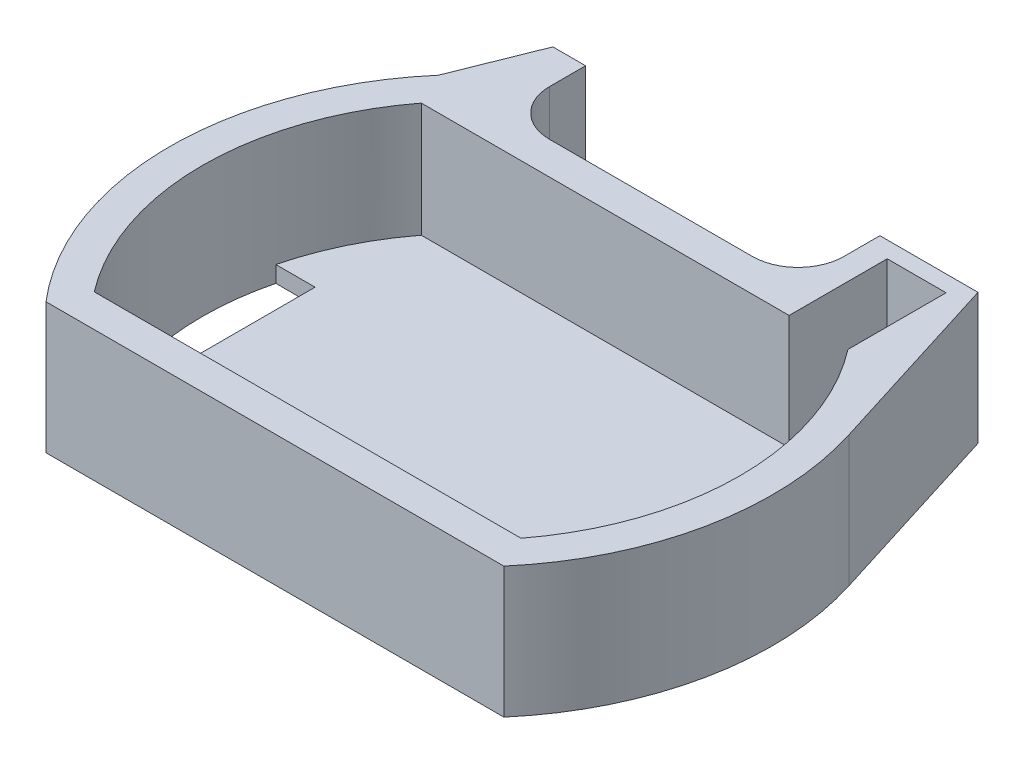
ISO-10303-21;
HEADER;
FILE_DESCRIPTION(('STEP AP214'),'2;1');
FILE_NAME('part.step','',(''),(''),'','','');
FILE_SCHEMA(('AUTOMOTIVE_DESIGN { 1 0 10303 214 1 1 1 1 }'));
ENDSEC;
DATA;
#1=APPLICATION_CONTEXT('core data for automotive mechanical design processes');
#2=APPLICATION_PROTOCOL_DEFINITION('international standard','automotive_design',2000,#1);
#3=PRODUCT_CONTEXT('',#1,'mechanical');
#4=PRODUCT('Part','Part','',(#3));
#5=PRODUCT_RELATED_PRODUCT_CATEGORY('part','',(#4));
#6=PRODUCT_DEFINITION_FORMATION('','',#4);
#7=PRODUCT_DEFINITION_CONTEXT('part definition',#1,'design');
#8=PRODUCT_DEFINITION('design','',#6,#7);
#9=PRODUCT_DEFINITION_SHAPE('','',#8);
#10=(LENGTH_UNIT() NAMED_UNIT(*) SI_UNIT(.MILLI.,.METRE.));
#11=(NAMED_UNIT(*) PLANE_ANGLE_UNIT() SI_UNIT($,.RADIAN.));
#12=(NAMED_UNIT(*) SI_UNIT($,.STERADIAN.) SOLID_ANGLE_UNIT());
#13=UNCERTAINTY_MEASURE_WITH_UNIT(LENGTH_MEASURE(1.E-05),#10,'distance_accuracy_value','');
#14=(GEOMETRIC_REPRESENTATION_CONTEXT(3) GLOBAL_UNCERTAINTY_ASSIGNED_CONTEXT((#13)) GLOBAL_UNIT_ASSIGNED_CONTEXT((#10,
#11,#12)) REPRESENTATION_CONTEXT('',''));
#15=CARTESIAN_POINT('',(0.,0.,0.));
#16=DIRECTION('',(0.,0.,1.));
#17=DIRECTION('',(1.,0.,0.));
#18=AXIS2_PLACEMENT_3D('',#15,#16,#17);
#19=CARTESIAN_POINT('',(0.,6.35,0.));
#20=DIRECTION('',(0.,1.,0.));
#21=DIRECTION('',(0.,0.,1.));
#22=AXIS2_PLACEMENT_3D('',#19,#20,#21);
#23=PLANE('',#22);
#24=DIRECTION('',(1.,0.,0.));
#25=VECTOR('',#24,1.);
#26=CARTESIAN_POINT('',(-86.010873324463,6.35,25.4));
#27=LINE('',#26,#25);
#28=CARTESIAN_POINT('',(-101.250873324463,6.35,25.4));
#29=VERTEX_POINT('',#28);
#30=CARTESIAN_POINT('',(-86.010873324463,6.35,25.4));
#31=VERTEX_POINT('',#30);
#32=EDGE_CURVE('E361',#29,#31,#27,.T.);
#33=ORIENTED_EDGE('',*,*,#32,.F.);
#34=CARTESIAN_POINT('',(0.,6.35,0.));
#35=DIRECTION('',(0.,1.,0.));
#36=DIRECTION('',(0.,0.,1.));
#37=AXIS2_PLACEMENT_3D('',#34,#35,#36);
#38=CIRCLE('',#37,104.38821460762);
#39=CARTESIAN_POINT('',(-82.8531794740942,6.35,63.5));
#40=VERTEX_POINT('',#39);
#41=EDGE_CURVE('E266',#29,#40,#38,.T.);
#42=ORIENTED_EDGE('',*,*,#41,.T.);
#43=DIRECTION('',(1.,0.,0.));
#44=VECTOR('',#43,1.);
#45=CARTESIAN_POINT('',(-82.8531794740942,6.35,63.5));
#46=LINE('',#45,#44);
#47=CARTESIAN_POINT('',(82.8531794740942,6.35,63.5));
#48=VERTEX_POINT('',#47);
#49=EDGE_CURVE('E264',#40,#48,#46,.T.);
#50=ORIENTED_EDGE('',*,*,#49,.T.);
#51=CARTESIAN_POINT('',(0.,6.35,0.));
#52=DIRECTION('',(0.,1.,0.));
#53=DIRECTION('',(0.,0.,1.));
#54=AXIS2_PLACEMENT_3D('',#51,#52,#53);
#55=CIRCLE('',#54,104.38821460762);
#56=CARTESIAN_POINT('',(101.250873324463,6.35,25.3999999999999));
#57=VERTEX_POINT('',#56);
#58=EDGE_CURVE('E270',#48,#57,#55,.T.);
#59=ORIENTED_EDGE('',*,*,#58,.T.);
#60=DIRECTION('',(1.,0.,0.));
#61=VECTOR('',#60,1.);
#62=CARTESIAN_POINT('',(86.010873324463,6.35,25.4));
#63=LINE('',#62,#61);
#64=CARTESIAN_POINT('',(86.010873324463,6.35,25.4));
#65=VERTEX_POINT('',#64);
#66=EDGE_CURVE('E328',#65,#57,#63,.T.);
#67=ORIENTED_EDGE('',*,*,#66,.F.);
#68=DIRECTION('',(0.,0.,1.));
#69=VECTOR('',#68,1.);
#70=CARTESIAN_POINT('',(86.010873324463,6.35,-25.4));
#71=LINE('',#70,#69);
#72=CARTESIAN_POINT('',(86.010873324463,6.35,-25.4));
#73=VERTEX_POINT('',#72);
#74=EDGE_CURVE('E323',#73,#65,#71,.T.);
#75=ORIENTED_EDGE('',*,*,#74,.F.);
#76=DIRECTION('',(-1.,0.,0.));
#77=VECTOR('',#76,1.);
#78=CARTESIAN_POINT('',(101.250873324463,6.35,-25.4));
#79=LINE('',#78,#77);
#80=CARTESIAN_POINT('',(101.250873324463,6.35,-25.4));
#81=VERTEX_POINT('',#80);
#82=EDGE_CURVE('E320',#81,#73,#79,.T.);
#83=ORIENTED_EDGE('',*,*,#82,.F.);
#84=CARTESIAN_POINT('',(82.8531794740942,6.35,-63.5));
#85=VERTEX_POINT('',#84);
#86=EDGE_CURVE('E274',#81,#85,#55,.T.);
#87=ORIENTED_EDGE('',*,*,#86,.T.);
#88=DIRECTION('',(0.,0.,1.));
#89=VECTOR('',#88,1.);
#90=CARTESIAN_POINT('',(82.8531794740942,6.35,-63.5));
#91=LINE('',#90,#89);
#92=CARTESIAN_POINT('',(82.8531794740942,6.35,-101.6));
#93=VERTEX_POINT('',#92);
#94=EDGE_CURVE('E229',#93,#85,#91,.T.);
#95=ORIENTED_EDGE('',*,*,#94,.F.);
#96=DIRECTION('',(1.,0.,0.));
#97=VECTOR('',#96,1.);
#98=CARTESIAN_POINT('',(59.9931794740942,6.35,-101.6));
#99=LINE('',#98,#97);
#100=CARTESIAN_POINT('',(59.9931794740942,6.35,-101.6));
#101=VERTEX_POINT('',#100);
#102=EDGE_CURVE('E928',#101,#93,#99,.T.);
#103=ORIENTED_EDGE('',*,*,#102,.F.);
#104=DIRECTION('',(0.,0.,-1.));
#105=VECTOR('',#104,1.);
#106=CARTESIAN_POINT('',(59.9931794740942,6.35,-63.5));
#107=LINE('',#106,#105);
#108=CARTESIAN_POINT('',(59.9931794740941,6.35,-63.5));
#109=VERTEX_POINT('',#108);
#110=EDGE_CURVE('E532',#109,#101,#107,.T.);
#111=ORIENTED_EDGE('',*,*,#110,.F.);
#112=DIRECTION('',(-1.,0.,0.));
#113=VECTOR('',#112,1.);
#114=CARTESIAN_POINT('',(-82.8531794740941,6.35,-63.5));
#115=LINE('',#114,#113);
#116=CARTESIAN_POINT('',(-82.8531794740941,6.35,-63.5));
#117=VERTEX_POINT('',#116);
#118=EDGE_CURVE('E273',#109,#117,#115,.T.);
#119=ORIENTED_EDGE('',*,*,#118,.T.);
#120=CARTESIAN_POINT('',(-101.250873324463,6.35,-25.4));
#121=VERTEX_POINT('',#120);
#122=EDGE_CURVE('E261',#117,#121,#38,.T.);
#123=ORIENTED_EDGE('',*,*,#122,.T.);
#124=DIRECTION('',(-1.,0.,0.));
#125=VECTOR('',#124,1.);
#126=CARTESIAN_POINT('',(-101.250873324463,6.35,-25.4));
#127=LINE('',#126,#125);
#128=CARTESIAN_POINT('',(-86.010873324463,6.35,-25.4));
#129=VERTEX_POINT('',#128);
#130=EDGE_CURVE('E369',#129,#121,#127,.T.);
#131=ORIENTED_EDGE('',*,*,#130,.F.);
#132=DIRECTION('',(0.,0.,-1.));
#133=VECTOR('',#132,1.);
#134=CARTESIAN_POINT('',(-86.010873324463,6.35,-25.4));
#135=LINE('',#134,#133);
#136=EDGE_CURVE('E364',#31,#129,#135,.T.);
#137=ORIENTED_EDGE('',*,*,#136,.F.);
#138=EDGE_LOOP('',(#33,#42,#50,#59,#67,#75,#83,#87,#95,#103,#111,#119,#123,#131,#137));
#139=FACE_BOUND('',#138,.T.);
#140=ADVANCED_FACE('F43',(#139),#23,.T.);
#141=CARTESIAN_POINT('',(0.,0.,0.));
#142=DIRECTION('',(0.,1.,0.));
#143=DIRECTION('',(0.,0.,1.));
#144=AXIS2_PLACEMENT_3D('',#141,#142,#143);
#145=PLANE('',#144);
#146=CARTESIAN_POINT('',(0.,0.,0.));
#147=DIRECTION('',(0.,1.,0.));
#148=DIRECTION('',(0.,0.,1.));
#149=AXIS2_PLACEMENT_3D('',#146,#147,#148);
#150=CIRCLE('',#149,104.38821460762);
#151=CARTESIAN_POINT('',(-101.250873324463,0.,-25.4));
#152=VERTEX_POINT('',#151);
#153=CARTESIAN_POINT('',(-101.250873324463,0.,25.4));
#154=VERTEX_POINT('',#153);
#155=EDGE_CURVE('E360',#152,#154,#150,.T.);
#156=ORIENTED_EDGE('',*,*,#155,.T.);
#157=DIRECTION('',(1.,0.,0.));
#158=VECTOR('',#157,1.);
#159=CARTESIAN_POINT('',(-86.010873324463,0.,25.4));
#160=LINE('',#159,#158);
#161=CARTESIAN_POINT('',(-86.010873324463,0.,25.4));
#162=VERTEX_POINT('',#161);
#163=EDGE_CURVE('E377',#154,#162,#160,.T.);
#164=ORIENTED_EDGE('',*,*,#163,.T.);
#165=DIRECTION('',(0.,0.,-1.));
#166=VECTOR('',#165,1.);
#167=CARTESIAN_POINT('',(-86.010873324463,0.,-25.4));
#168=LINE('',#167,#166);
#169=CARTESIAN_POINT('',(-86.010873324463,0.,-25.4));
#170=VERTEX_POINT('',#169);
#171=EDGE_CURVE('E381',#162,#170,#168,.T.);
#172=ORIENTED_EDGE('',*,*,#171,.T.);
#173=DIRECTION('',(-1.,0.,0.));
#174=VECTOR('',#173,1.);
#175=CARTESIAN_POINT('',(-101.250873324463,0.,-25.4));
#176=LINE('',#175,#174);
#177=EDGE_CURVE('E365',#170,#152,#176,.T.);
#178=ORIENTED_EDGE('',*,*,#177,.T.);
#179=EDGE_LOOP('',(#156,#164,#172,#178));
#180=FACE_BOUND('',#179,.T.);
#181=CARTESIAN_POINT('',(0.,0.,0.));
#182=DIRECTION('',(0.,1.,0.));
#183=DIRECTION('',(0.,0.,1.));
#184=AXIS2_PLACEMENT_3D('',#181,#182,#183);
#185=CIRCLE('',#184,117.08821460762);
#186=CARTESIAN_POINT('',(-88.9,0.,-76.2));
#187=VERTEX_POINT('',#186);
#188=CARTESIAN_POINT('',(-88.9,0.,76.2));
#189=VERTEX_POINT('',#188);
#190=EDGE_CURVE('E401',#187,#189,#185,.T.);
#191=ORIENTED_EDGE('',*,*,#190,.F.);
#192=DIRECTION('',(-0.371390676354103,0.,0.92847669088526));
#193=VECTOR('',#192,1.);
#194=CARTESIAN_POINT('',(-88.9,0.,-76.2));
#195=LINE('',#194,#193);
#196=CARTESIAN_POINT('',(-76.2,0.,-107.95));
#197=VERTEX_POINT('',#196);
#198=EDGE_CURVE('E428',#197,#187,#195,.T.);
#199=ORIENTED_EDGE('',*,*,#198,.F.);
#200=DIRECTION('',(-1.,0.,0.));
#201=VECTOR('',#200,1.);
#202=CARTESIAN_POINT('',(-76.2,0.,-107.95));
#203=LINE('',#202,#201);
#204=CARTESIAN_POINT('',(-63.5,0.,-107.95));
#205=VERTEX_POINT('',#204);
#206=EDGE_CURVE('E425',#205,#197,#203,.T.);
#207=ORIENTED_EDGE('',*,*,#206,.F.);
#208=DIRECTION('',(0.,0.,-1.));
#209=VECTOR('',#208,1.);
#210=CARTESIAN_POINT('',(-63.5,0.,-107.95));
#211=LINE('',#210,#209);
#212=CARTESIAN_POINT('',(-63.5,0.,-93.98));
#213=VERTEX_POINT('',#212);
#214=EDGE_CURVE('E422',#213,#205,#211,.T.);
#215=ORIENTED_EDGE('',*,*,#214,.F.);
#216=CARTESIAN_POINT('',(-45.72,0.,-93.98));
#217=DIRECTION('',(0.,1.,0.));
#218=DIRECTION('',(0.,0.,1.));
#219=AXIS2_PLACEMENT_3D('',#216,#217,#218);
#220=CIRCLE('',#219,17.78);
#221=CARTESIAN_POINT('',(-45.72,0.,-76.2));
#222=VERTEX_POINT('',#221);
#223=EDGE_CURVE('E52',#213,#222,#220,.T.);
#224=ORIENTED_EDGE('',*,*,#223,.T.);
#225=DIRECTION('',(-1.,0.,0.));
#226=VECTOR('',#225,1.);
#227=CARTESIAN_POINT('',(-63.5,0.,-76.2));
#228=LINE('',#227,#226);
#229=CARTESIAN_POINT('',(33.02,0.,-76.2));
#230=VERTEX_POINT('',#229);
#231=EDGE_CURVE('E418',#230,#222,#228,.T.);
#232=ORIENTED_EDGE('',*,*,#231,.F.);
#233=CARTESIAN_POINT('',(33.02,0.,-93.98));
#234=DIRECTION('',(0.,1.,0.));
#235=DIRECTION('',(0.,0.,1.));
#236=AXIS2_PLACEMENT_3D('',#233,#234,#235);
#237=CIRCLE('',#236,17.78);
#238=CARTESIAN_POINT('',(50.8,0.,-93.98));
#239=VERTEX_POINT('',#238);
#240=EDGE_CURVE('E475',#230,#239,#237,.T.);
#241=ORIENTED_EDGE('',*,*,#240,.T.);
#242=DIRECTION('',(0.,0.,-1.));
#243=VECTOR('',#242,1.);
#244=CARTESIAN_POINT('',(50.8,0.,-107.95));
#245=LINE('',#244,#243);
#246=CARTESIAN_POINT('',(50.8,0.,-107.95));
#247=VERTEX_POINT('',#246);
#248=EDGE_CURVE('E265',#239,#247,#245,.T.);
#249=ORIENTED_EDGE('',*,*,#248,.T.);
#250=DIRECTION('',(-1.,0.,0.));
#251=VECTOR('',#250,1.);
#252=CARTESIAN_POINT('',(88.9,0.,-107.95));
#253=LINE('',#252,#251);
#254=CARTESIAN_POINT('',(88.9,0.,-107.95));
#255=VERTEX_POINT('',#254);
#256=EDGE_CURVE('E414',#255,#247,#253,.T.);
#257=ORIENTED_EDGE('',*,*,#256,.F.);
#258=DIRECTION('',(-0.298726159680136,0.,-0.954338871430247));
#259=VECTOR('',#258,1.);
#260=CARTESIAN_POINT('',(111.741834586418,0.,-34.9773126935378));
#261=LINE('',#260,#259);
#262=CARTESIAN_POINT('',(111.741834586418,0.,-34.9773126935378));
#263=VERTEX_POINT('',#262);
#264=EDGE_CURVE('E411',#263,#255,#261,.T.);
#265=ORIENTED_EDGE('',*,*,#264,.F.);
#266=CARTESIAN_POINT('',(0.,0.,0.));
#267=DIRECTION('',(0.,1.,0.));
#268=DIRECTION('',(0.,0.,-1.));
#269=AXIS2_PLACEMENT_3D('',#266,#267,#268);
#270=CIRCLE('',#269,117.08821460762);
#271=CARTESIAN_POINT('',(88.9,0.,76.2));
#272=VERTEX_POINT('',#271);
#273=EDGE_CURVE('E408',#272,#263,#270,.T.);
#274=ORIENTED_EDGE('',*,*,#273,.F.);
#275=DIRECTION('',(1.,0.,0.));
#276=VECTOR('',#275,1.);
#277=CARTESIAN_POINT('',(-88.9,0.,76.2));
#278=LINE('',#277,#276);
#279=EDGE_CURVE('E405',#189,#272,#278,.T.);
#280=ORIENTED_EDGE('',*,*,#279,.F.);
#281=EDGE_LOOP('',(#191,#199,#207,#215,#224,#232,#241,#249,#257,#265,#274,#280));
#282=FACE_BOUND('',#281,.T.);
#283=CARTESIAN_POINT('',(0.,0.,0.));
#284=DIRECTION('',(0.,1.,0.));
#285=DIRECTION('',(0.,0.,-1.));
#286=AXIS2_PLACEMENT_3D('',#283,#284,#285);
#287=CIRCLE('',#286,104.38821460762);
#288=CARTESIAN_POINT('',(101.250873324463,0.,25.3999999999999));
#289=VERTEX_POINT('',#288);
#290=CARTESIAN_POINT('',(101.250873324463,0.,-25.4));
#291=VERTEX_POINT('',#290);
#292=EDGE_CURVE('E319',#289,#291,#287,.T.);
#293=ORIENTED_EDGE('',*,*,#292,.T.);
#294=DIRECTION('',(-1.,0.,0.));
#295=VECTOR('',#294,1.);
#296=CARTESIAN_POINT('',(101.250873324463,0.,-25.4));
#297=LINE('',#296,#295);
#298=CARTESIAN_POINT('',(86.010873324463,0.,-25.4));
#299=VERTEX_POINT('',#298);
#300=EDGE_CURVE('E336',#291,#299,#297,.T.);
#301=ORIENTED_EDGE('',*,*,#300,.T.);
#302=DIRECTION('',(0.,0.,1.));
#303=VECTOR('',#302,1.);
#304=CARTESIAN_POINT('',(86.010873324463,0.,-25.4));
#305=LINE('',#304,#303);
#306=CARTESIAN_POINT('',(86.010873324463,0.,25.4));
#307=VERTEX_POINT('',#306);
#308=EDGE_CURVE('E340',#299,#307,#305,.T.);
#309=ORIENTED_EDGE('',*,*,#308,.T.);
#310=DIRECTION('',(1.,0.,0.));
#311=VECTOR('',#310,1.);
#312=CARTESIAN_POINT('',(86.010873324463,0.,25.4));
#313=LINE('',#312,#311);
#314=EDGE_CURVE('E324',#307,#289,#313,.T.);
#315=ORIENTED_EDGE('',*,*,#314,.T.);
#316=EDGE_LOOP('',(#293,#301,#309,#315));
#317=FACE_BOUND('',#316,.T.);
#318=ADVANCED_FACE('F482',(#180,#282,#317),#145,.F.);
#319=CARTESIAN_POINT('',(0.,6.35,0.));
#320=DIRECTION('',(0.,-1.,0.));
#321=DIRECTION('',(0.,0.,-1.));
#322=AXIS2_PLACEMENT_3D('',#319,#320,#321);
#323=CYLINDRICAL_SURFACE('',#322,117.08821460762);
#324=ORIENTED_EDGE('',*,*,#190,.T.);
#325=DIRECTION('',(0.,-1.,0.));
#326=VECTOR('',#325,1.);
#327=CARTESIAN_POINT('',(-88.9,6.35,76.2));
#328=LINE('',#327,#326);
#329=CARTESIAN_POINT('',(-88.9,50.8,76.2));
#330=VERTEX_POINT('',#329);
#331=EDGE_CURVE('E455',#330,#189,#328,.T.);
#332=ORIENTED_EDGE('',*,*,#331,.F.);
#333=CARTESIAN_POINT('',(0.,50.8,0.));
#334=DIRECTION('',(0.,1.,0.));
#335=DIRECTION('',(0.,0.,1.));
#336=AXIS2_PLACEMENT_3D('',#333,#334,#335);
#337=CIRCLE('',#336,117.08821460762);
#338=CARTESIAN_POINT('',(-88.9,50.8,-76.2));
#339=VERTEX_POINT('',#338);
#340=EDGE_CURVE('E311',#339,#330,#337,.T.);
#341=ORIENTED_EDGE('',*,*,#340,.F.);
#342=DIRECTION('',(0.,-1.,0.));
#343=VECTOR('',#342,1.);
#344=CARTESIAN_POINT('',(-88.9,6.35,-76.2));
#345=LINE('',#344,#343);
#346=EDGE_CURVE('E431',#339,#187,#345,.T.);
#347=ORIENTED_EDGE('',*,*,#346,.T.);
#348=EDGE_LOOP('',(#324,#332,#341,#347));
#349=FACE_BOUND('',#348,.T.);
#350=ADVANCED_FACE('F501',(#349),#323,.T.);
#351=CARTESIAN_POINT('',(-88.9,6.35,76.2));
#352=DIRECTION('',(0.,0.,-1.));
#353=DIRECTION('',(-1.,0.,0.));
#354=AXIS2_PLACEMENT_3D('',#351,#352,#353);
#355=PLANE('',#354);
#356=ORIENTED_EDGE('',*,*,#279,.T.);
#357=DIRECTION('',(0.,-1.,0.));
#358=VECTOR('',#357,1.);
#359=CARTESIAN_POINT('',(88.9,6.35,76.2));
#360=LINE('',#359,#358);
#361=CARTESIAN_POINT('',(88.9,50.8,76.2));
#362=VERTEX_POINT('',#361);
#363=EDGE_CURVE('E451',#362,#272,#360,.T.);
#364=ORIENTED_EDGE('',*,*,#363,.F.);
#365=DIRECTION('',(1.,0.,0.));
#366=VECTOR('',#365,1.);
#367=CARTESIAN_POINT('',(-88.9,50.8,76.2));
#368=LINE('',#367,#366);
#369=EDGE_CURVE('E315',#330,#362,#368,.T.);
#370=ORIENTED_EDGE('',*,*,#369,.F.);
#371=ORIENTED_EDGE('',*,*,#331,.T.);
#372=EDGE_LOOP('',(#356,#364,#370,#371));
#373=FACE_BOUND('',#372,.T.);
#374=ADVANCED_FACE('F506',(#373),#355,.F.);
#375=CARTESIAN_POINT('',(0.,6.35,0.));
#376=DIRECTION('',(0.,-1.,0.));
#377=DIRECTION('',(0.,0.,-1.));
#378=AXIS2_PLACEMENT_3D('',#375,#376,#377);
#379=CYLINDRICAL_SURFACE('',#378,117.08821460762);
#380=ORIENTED_EDGE('',*,*,#273,.T.);
#381=DIRECTION('',(0.,-1.,0.));
#382=VECTOR('',#381,1.);
#383=CARTESIAN_POINT('',(111.741834586418,6.35,-34.9773126935378));
#384=LINE('',#383,#382);
#385=CARTESIAN_POINT('',(111.741834586418,50.8,-34.9773126935378));
#386=VERTEX_POINT('',#385);
#387=EDGE_CURVE('E447',#386,#263,#384,.T.);
#388=ORIENTED_EDGE('',*,*,#387,.F.);
#389=CARTESIAN_POINT('',(0.,50.8,0.));
#390=DIRECTION('',(0.,1.,0.));
#391=DIRECTION('',(0.,0.,1.));
#392=AXIS2_PLACEMENT_3D('',#389,#390,#391);
#393=CIRCLE('',#392,117.08821460762);
#394=EDGE_CURVE('E286',#362,#386,#393,.T.);
#395=ORIENTED_EDGE('',*,*,#394,.F.);
#396=ORIENTED_EDGE('',*,*,#363,.T.);
#397=EDGE_LOOP('',(#380,#388,#395,#396));
#398=FACE_BOUND('',#397,.T.);
#399=ADVANCED_FACE('F509',(#398),#379,.T.);
#400=CARTESIAN_POINT('',(111.741834586418,6.35,-34.9773126935378));
#401=DIRECTION('',(-0.954338871430247,0.,0.298726159680136));
#402=DIRECTION('',(0.298726159680136,0.,0.954338871430247));
#403=AXIS2_PLACEMENT_3D('',#400,#401,#402);
#404=PLANE('',#403);
#405=ORIENTED_EDGE('',*,*,#264,.T.);
#406=DIRECTION('',(0.,-1.,0.));
#407=VECTOR('',#406,1.);
#408=CARTESIAN_POINT('',(88.9,6.35,-107.95));
#409=LINE('',#408,#407);
#410=CARTESIAN_POINT('',(88.9,50.8,-107.95));
#411=VERTEX_POINT('',#410);
#412=EDGE_CURVE('E443',#411,#255,#409,.T.);
#413=ORIENTED_EDGE('',*,*,#412,.F.);
#414=DIRECTION('',(-0.298726159680136,0.,-0.954338871430247));
#415=VECTOR('',#414,1.);
#416=CARTESIAN_POINT('',(111.741834586418,50.8,-34.9773126935378));
#417=LINE('',#416,#415);
#418=EDGE_CURVE('E290',#386,#411,#417,.T.);
#419=ORIENTED_EDGE('',*,*,#418,.F.);
#420=ORIENTED_EDGE('',*,*,#387,.T.);
#421=EDGE_LOOP('',(#405,#413,#419,#420));
#422=FACE_BOUND('',#421,.T.);
#423=ADVANCED_FACE('F512',(#422),#404,.F.);
#424=CARTESIAN_POINT('',(88.9,6.35,-107.95));
#425=DIRECTION('',(0.,0.,1.));
#426=DIRECTION('',(1.,0.,0.));
#427=AXIS2_PLACEMENT_3D('',#424,#425,#426);
#428=PLANE('',#427);
#429=ORIENTED_EDGE('',*,*,#256,.T.);
#430=DIRECTION('',(0.,1.,0.));
#431=VECTOR('',#430,1.);
#432=CARTESIAN_POINT('',(50.8,-34.1957965253041,-107.95));
#433=LINE('',#432,#431);
#434=CARTESIAN_POINT('',(50.8,50.8,-107.95));
#435=VERTEX_POINT('',#434);
#436=EDGE_CURVE('E520',#247,#435,#433,.T.);
#437=ORIENTED_EDGE('',*,*,#436,.T.);
#438=DIRECTION('',(-1.,0.,0.));
#439=VECTOR('',#438,1.);
#440=CARTESIAN_POINT('',(88.9,50.8,-107.95));
#441=LINE('',#440,#439);
#442=EDGE_CURVE('E294',#411,#435,#441,.T.);
#443=ORIENTED_EDGE('',*,*,#442,.F.);
#444=ORIENTED_EDGE('',*,*,#412,.T.);
#445=EDGE_LOOP('',(#429,#437,#443,#444));
#446=FACE_BOUND('',#445,.T.);
#447=ADVANCED_FACE('F517',(#446),#428,.F.);
#448=CARTESIAN_POINT('',(-63.5,6.35,-76.2));
#449=DIRECTION('',(0.,0.,1.));
#450=DIRECTION('',(1.,0.,0.));
#451=AXIS2_PLACEMENT_3D('',#448,#449,#450);
#452=PLANE('',#451);
#453=DIRECTION('',(-1.,0.,0.));
#454=VECTOR('',#453,1.);
#455=CARTESIAN_POINT('',(63.5,50.8,-76.2));
#456=LINE('',#455,#454);
#457=CARTESIAN_POINT('',(33.02,50.8,-76.2));
#458=VERTEX_POINT('',#457);
#459=CARTESIAN_POINT('',(-45.72,50.8,-76.2));
#460=VERTEX_POINT('',#459);
#461=EDGE_CURVE('E297',#458,#460,#456,.T.);
#462=ORIENTED_EDGE('',*,*,#461,.F.);
#463=DIRECTION('',(0.,1.,0.));
#464=VECTOR('',#463,1.);
#465=CARTESIAN_POINT('',(33.02,6.35,-76.2));
#466=LINE('',#465,#464);
#467=EDGE_CURVE('E466',#458,#230,#466,.F.);
#468=ORIENTED_EDGE('',*,*,#467,.T.);
#469=ORIENTED_EDGE('',*,*,#231,.T.);
#470=DIRECTION('',(0.,-1.,0.));
#471=VECTOR('',#470,1.);
#472=CARTESIAN_POINT('',(-45.72,50.8,-76.2));
#473=LINE('',#472,#471);
#474=EDGE_CURVE('E463',#222,#460,#473,.F.);
#475=ORIENTED_EDGE('',*,*,#474,.T.);
#476=EDGE_LOOP('',(#462,#468,#469,#475));
#477=FACE_BOUND('',#476,.T.);
#478=ADVANCED_FACE('F488',(#477),#452,.F.);
#479=CARTESIAN_POINT('',(-63.5,6.35,-107.95));
#480=DIRECTION('',(-1.,0.,0.));
#481=DIRECTION('',(0.,0.,1.));
#482=AXIS2_PLACEMENT_3D('',#479,#480,#481);
#483=PLANE('',#482);
#484=DIRECTION('',(0.,0.,-1.));
#485=VECTOR('',#484,1.);
#486=CARTESIAN_POINT('',(-63.5,50.8,-76.2));
#487=LINE('',#486,#485);
#488=CARTESIAN_POINT('',(-63.5,50.8,-93.98));
#489=VERTEX_POINT('',#488);
#490=CARTESIAN_POINT('',(-63.5,50.8,-107.95));
#491=VERTEX_POINT('',#490);
#492=EDGE_CURVE('E300',#489,#491,#487,.T.);
#493=ORIENTED_EDGE('',*,*,#492,.F.);
#494=DIRECTION('',(0.,-1.,0.));
#495=VECTOR('',#494,1.);
#496=CARTESIAN_POINT('',(-63.5,0.,-93.98));
#497=LINE('',#496,#495);
#498=EDGE_CURVE('E469',#489,#213,#497,.T.);
#499=ORIENTED_EDGE('',*,*,#498,.T.);
#500=ORIENTED_EDGE('',*,*,#214,.T.);
#501=DIRECTION('',(0.,-1.,0.));
#502=VECTOR('',#501,1.);
#503=CARTESIAN_POINT('',(-63.5,6.35,-107.95));
#504=LINE('',#503,#502);
#505=EDGE_CURVE('E439',#491,#205,#504,.T.);
#506=ORIENTED_EDGE('',*,*,#505,.F.);
#507=EDGE_LOOP('',(#493,#499,#500,#506));
#508=FACE_BOUND('',#507,.T.);
#509=ADVANCED_FACE('F491',(#508),#483,.F.);
#510=CARTESIAN_POINT('',(-76.2,6.35,-107.95));
#511=DIRECTION('',(0.,0.,1.));
#512=DIRECTION('',(1.,0.,0.));
#513=AXIS2_PLACEMENT_3D('',#510,#511,#512);
#514=PLANE('',#513);
#515=ORIENTED_EDGE('',*,*,#206,.T.);
#516=DIRECTION('',(0.,-1.,0.));
#517=VECTOR('',#516,1.);
#518=CARTESIAN_POINT('',(-76.2,6.35,-107.95));
#519=LINE('',#518,#517);
#520=CARTESIAN_POINT('',(-76.2,50.8,-107.95));
#521=VERTEX_POINT('',#520);
#522=EDGE_CURVE('E435',#521,#197,#519,.T.);
#523=ORIENTED_EDGE('',*,*,#522,.F.);
#524=DIRECTION('',(-1.,0.,0.));
#525=VECTOR('',#524,1.);
#526=CARTESIAN_POINT('',(-63.5,50.8,-107.95));
#527=LINE('',#526,#525);
#528=EDGE_CURVE('E303',#491,#521,#527,.T.);
#529=ORIENTED_EDGE('',*,*,#528,.F.);
#530=ORIENTED_EDGE('',*,*,#505,.T.);
#531=EDGE_LOOP('',(#515,#523,#529,#530));
#532=FACE_BOUND('',#531,.T.);
#533=ADVANCED_FACE('F587',(#532),#514,.F.);
#534=CARTESIAN_POINT('',(-88.9,6.35,-76.2));
#535=DIRECTION('',(0.92847669088526,0.,0.371390676354103));
#536=DIRECTION('',(0.371390676354103,0.,-0.92847669088526));
#537=AXIS2_PLACEMENT_3D('',#534,#535,#536);
#538=PLANE('',#537);
#539=ORIENTED_EDGE('',*,*,#198,.T.);
#540=ORIENTED_EDGE('',*,*,#346,.F.);
#541=DIRECTION('',(-0.371390676354103,0.,0.92847669088526));
#542=VECTOR('',#541,1.);
#543=CARTESIAN_POINT('',(-76.2,50.8,-107.95));
#544=LINE('',#543,#542);
#545=EDGE_CURVE('E307',#521,#339,#544,.T.);
#546=ORIENTED_EDGE('',*,*,#545,.F.);
#547=ORIENTED_EDGE('',*,*,#522,.T.);
#548=EDGE_LOOP('',(#539,#540,#546,#547));
#549=FACE_BOUND('',#548,.T.);
#550=ADVANCED_FACE('F498',(#549),#538,.F.);
#551=CARTESIAN_POINT('',(0.,6.35,0.));
#552=DIRECTION('',(0.,-1.,0.));
#553=DIRECTION('',(0.,0.,-1.));
#554=AXIS2_PLACEMENT_3D('',#551,#552,#553);
#555=CYLINDRICAL_SURFACE('',#554,104.38821460762);
#556=ORIENTED_EDGE('',*,*,#155,.F.);
#557=DIRECTION('',(0.,-1.,0.));
#558=VECTOR('',#557,1.);
#559=CARTESIAN_POINT('',(-101.250873324463,6.35,-25.4));
#560=LINE('',#559,#558);
#561=EDGE_CURVE('E373',#121,#152,#560,.T.);
#562=ORIENTED_EDGE('',*,*,#561,.F.);
#563=ORIENTED_EDGE('',*,*,#122,.F.);
#564=DIRECTION('',(0.,-1.,0.));
#565=VECTOR('',#564,1.);
#566=CARTESIAN_POINT('',(-82.8531794740941,50.8,-63.5));
#567=LINE('',#566,#565);
#568=CARTESIAN_POINT('',(-82.8531794740941,50.8,-63.5));
#569=VERTEX_POINT('',#568);
#570=EDGE_CURVE('E235',#569,#117,#567,.T.);
#571=ORIENTED_EDGE('',*,*,#570,.F.);
#572=CARTESIAN_POINT('',(0.,50.8,0.));
#573=DIRECTION('',(0.,1.,0.));
#574=DIRECTION('',(0.,0.,1.));
#575=AXIS2_PLACEMENT_3D('',#572,#573,#574);
#576=CIRCLE('',#575,104.38821460762);
#577=CARTESIAN_POINT('',(-82.8531794740942,50.8,63.5));
#578=VERTEX_POINT('',#577);
#579=EDGE_CURVE('E257',#569,#578,#576,.T.);
#580=ORIENTED_EDGE('',*,*,#579,.T.);
#581=DIRECTION('',(0.,-1.,0.));
#582=VECTOR('',#581,1.);
#583=CARTESIAN_POINT('',(-82.8531794740942,50.8,63.5));
#584=LINE('',#583,#582);
#585=EDGE_CURVE('E282',#578,#40,#584,.T.);
#586=ORIENTED_EDGE('',*,*,#585,.T.);
#587=ORIENTED_EDGE('',*,*,#41,.F.);
#588=DIRECTION('',(0.,-1.,0.));
#589=VECTOR('',#588,1.);
#590=CARTESIAN_POINT('',(-101.250873324463,6.35,25.4));
#591=LINE('',#590,#589);
#592=EDGE_CURVE('E397',#29,#154,#591,.T.);
#593=ORIENTED_EDGE('',*,*,#592,.T.);
#594=EDGE_LOOP('',(#556,#562,#563,#571,#580,#586,#587,#593));
#595=FACE_BOUND('',#594,.T.);
#596=ADVANCED_FACE('F540',(#595),#555,.F.);
#597=CARTESIAN_POINT('',(-86.010873324463,6.35,25.4));
#598=DIRECTION('',(0.,0.,-1.));
#599=DIRECTION('',(-1.,0.,0.));
#600=AXIS2_PLACEMENT_3D('',#597,#598,#599);
#601=PLANE('',#600);
#602=ORIENTED_EDGE('',*,*,#163,.F.);
#603=ORIENTED_EDGE('',*,*,#592,.F.);
#604=ORIENTED_EDGE('',*,*,#32,.T.);
#605=DIRECTION('',(0.,-1.,0.));
#606=VECTOR('',#605,1.);
#607=CARTESIAN_POINT('',(-86.010873324463,6.35,25.4));
#608=LINE('',#607,#606);
#609=EDGE_CURVE('E394',#31,#162,#608,.T.);
#610=ORIENTED_EDGE('',*,*,#609,.T.);
#611=EDGE_LOOP('',(#602,#603,#604,#610));
#612=FACE_BOUND('',#611,.T.);
#613=ADVANCED_FACE('F705',(#612),#601,.T.);
#614=CARTESIAN_POINT('',(-86.010873324463,6.35,-25.4));
#615=DIRECTION('',(-1.,0.,0.));
#616=DIRECTION('',(0.,0.,1.));
#617=AXIS2_PLACEMENT_3D('',#614,#615,#616);
#618=PLANE('',#617);
#619=ORIENTED_EDGE('',*,*,#171,.F.);
#620=ORIENTED_EDGE('',*,*,#609,.F.);
#621=ORIENTED_EDGE('',*,*,#136,.T.);
#622=DIRECTION('',(0.,-1.,0.));
#623=VECTOR('',#622,1.);
#624=CARTESIAN_POINT('',(-86.010873324463,6.35,-25.4));
#625=LINE('',#624,#623);
#626=EDGE_CURVE('E391',#129,#170,#625,.T.);
#627=ORIENTED_EDGE('',*,*,#626,.T.);
#628=EDGE_LOOP('',(#619,#620,#621,#627));
#629=FACE_BOUND('',#628,.T.);
#630=ADVANCED_FACE('F711',(#629),#618,.T.);
#631=CARTESIAN_POINT('',(-101.250873324463,6.35,-25.4));
#632=DIRECTION('',(0.,0.,1.));
#633=DIRECTION('',(1.,0.,0.));
#634=AXIS2_PLACEMENT_3D('',#631,#632,#633);
#635=PLANE('',#634);
#636=ORIENTED_EDGE('',*,*,#177,.F.);
#637=ORIENTED_EDGE('',*,*,#626,.F.);
#638=ORIENTED_EDGE('',*,*,#130,.T.);
#639=ORIENTED_EDGE('',*,*,#561,.T.);
#640=EDGE_LOOP('',(#636,#637,#638,#639));
#641=FACE_BOUND('',#640,.T.);
#642=ADVANCED_FACE('F719',(#641),#635,.T.);
#643=CARTESIAN_POINT('',(0.,6.35,0.));
#644=DIRECTION('',(0.,-1.,0.));
#645=DIRECTION('',(0.,0.,-1.));
#646=AXIS2_PLACEMENT_3D('',#643,#644,#645);
#647=CYLINDRICAL_SURFACE('',#646,104.38821460762);
#648=ORIENTED_EDGE('',*,*,#292,.F.);
#649=DIRECTION('',(0.,-1.,0.));
#650=VECTOR('',#649,1.);
#651=CARTESIAN_POINT('',(101.250873324463,6.35,25.3999999999999));
#652=LINE('',#651,#650);
#653=EDGE_CURVE('E332',#57,#289,#652,.T.);
#654=ORIENTED_EDGE('',*,*,#653,.F.);
#655=ORIENTED_EDGE('',*,*,#58,.F.);
#656=DIRECTION('',(0.,-1.,0.));
#657=VECTOR('',#656,1.);
#658=CARTESIAN_POINT('',(82.8531794740942,50.8,63.5));
#659=LINE('',#658,#657);
#660=CARTESIAN_POINT('',(82.8531794740942,50.8,63.5));
#661=VERTEX_POINT('',#660);
#662=EDGE_CURVE('E234',#661,#48,#659,.T.);
#663=ORIENTED_EDGE('',*,*,#662,.F.);
#664=CARTESIAN_POINT('',(0.,50.8,0.));
#665=DIRECTION('',(0.,1.,0.));
#666=DIRECTION('',(0.,0.,1.));
#667=AXIS2_PLACEMENT_3D('',#664,#665,#666);
#668=CIRCLE('',#667,104.38821460762);
#669=CARTESIAN_POINT('',(82.8531794740942,50.8,-63.5));
#670=VERTEX_POINT('',#669);
#671=EDGE_CURVE('E242',#661,#670,#668,.T.);
#672=ORIENTED_EDGE('',*,*,#671,.T.);
#673=DIRECTION('',(0.,-1.,0.));
#674=VECTOR('',#673,1.);
#675=CARTESIAN_POINT('',(82.8531794740942,50.8,-63.5));
#676=LINE('',#675,#674);
#677=EDGE_CURVE('E222',#670,#85,#676,.T.);
#678=ORIENTED_EDGE('',*,*,#677,.T.);
#679=ORIENTED_EDGE('',*,*,#86,.F.);
#680=DIRECTION('',(0.,-1.,0.));
#681=VECTOR('',#680,1.);
#682=CARTESIAN_POINT('',(101.250873324463,6.35,-25.4));
#683=LINE('',#682,#681);
#684=EDGE_CURVE('E356',#81,#291,#683,.T.);
#685=ORIENTED_EDGE('',*,*,#684,.T.);
#686=EDGE_LOOP('',(#648,#654,#655,#663,#672,#678,#679,#685));
#687=FACE_BOUND('',#686,.T.);
#688=ADVANCED_FACE('F248',(#687),#647,.F.);
#689=CARTESIAN_POINT('',(101.250873324463,6.35,-25.4));
#690=DIRECTION('',(0.,0.,1.));
#691=DIRECTION('',(1.,0.,0.));
#692=AXIS2_PLACEMENT_3D('',#689,#690,#691);
#693=PLANE('',#692);
#694=ORIENTED_EDGE('',*,*,#300,.F.);
#695=ORIENTED_EDGE('',*,*,#684,.F.);
#696=ORIENTED_EDGE('',*,*,#82,.T.);
#697=DIRECTION('',(0.,-1.,0.));
#698=VECTOR('',#697,1.);
#699=CARTESIAN_POINT('',(86.010873324463,6.35,-25.4));
#700=LINE('',#699,#698);
#701=EDGE_CURVE('E353',#73,#299,#700,.T.);
#702=ORIENTED_EDGE('',*,*,#701,.T.);
#703=EDGE_LOOP('',(#694,#695,#696,#702));
#704=FACE_BOUND('',#703,.T.);
#705=ADVANCED_FACE('F558',(#704),#693,.T.);
#706=CARTESIAN_POINT('',(86.010873324463,6.35,-25.4));
#707=DIRECTION('',(1.,0.,0.));
#708=DIRECTION('',(0.,0.,-1.));
#709=AXIS2_PLACEMENT_3D('',#706,#707,#708);
#710=PLANE('',#709);
#711=ORIENTED_EDGE('',*,*,#308,.F.);
#712=ORIENTED_EDGE('',*,*,#701,.F.);
#713=ORIENTED_EDGE('',*,*,#74,.T.);
#714=DIRECTION('',(0.,-1.,0.));
#715=VECTOR('',#714,1.);
#716=CARTESIAN_POINT('',(86.010873324463,6.35,25.4));
#717=LINE('',#716,#715);
#718=EDGE_CURVE('E350',#65,#307,#717,.T.);
#719=ORIENTED_EDGE('',*,*,#718,.T.);
#720=EDGE_LOOP('',(#711,#712,#713,#719));
#721=FACE_BOUND('',#720,.T.);
#722=ADVANCED_FACE('F566',(#721),#710,.T.);
#723=CARTESIAN_POINT('',(86.010873324463,6.35,25.4));
#724=DIRECTION('',(0.,0.,-1.));
#725=DIRECTION('',(-1.,0.,0.));
#726=AXIS2_PLACEMENT_3D('',#723,#724,#725);
#727=PLANE('',#726);
#728=ORIENTED_EDGE('',*,*,#314,.F.);
#729=ORIENTED_EDGE('',*,*,#718,.F.);
#730=ORIENTED_EDGE('',*,*,#66,.T.);
#731=ORIENTED_EDGE('',*,*,#653,.T.);
#732=EDGE_LOOP('',(#728,#729,#730,#731));
#733=FACE_BOUND('',#732,.T.);
#734=ADVANCED_FACE('F564',(#733),#727,.T.);
#735=CARTESIAN_POINT('',(0.,50.8,0.));
#736=DIRECTION('',(0.,1.,0.));
#737=DIRECTION('',(0.,0.,1.));
#738=AXIS2_PLACEMENT_3D('',#735,#736,#737);
#739=PLANE('',#738);
#740=DIRECTION('',(0.,0.,1.));
#741=VECTOR('',#740,1.);
#742=CARTESIAN_POINT('',(59.9931794740942,50.8,-63.5));
#743=LINE('',#742,#741);
#744=CARTESIAN_POINT('',(59.9931794740942,50.8,-101.6));
#745=VERTEX_POINT('',#744);
#746=CARTESIAN_POINT('',(59.9931794740942,50.8,-63.5));
#747=VERTEX_POINT('',#746);
#748=EDGE_CURVE('E916',#745,#747,#743,.T.);
#749=ORIENTED_EDGE('',*,*,#748,.F.);
#750=DIRECTION('',(-1.,0.,0.));
#751=VECTOR('',#750,1.);
#752=CARTESIAN_POINT('',(59.9931794740942,50.8,-101.6));
#753=LINE('',#752,#751);
#754=CARTESIAN_POINT('',(82.8531794740942,50.8,-101.6));
#755=VERTEX_POINT('',#754);
#756=EDGE_CURVE('E244',#755,#745,#753,.T.);
#757=ORIENTED_EDGE('',*,*,#756,.F.);
#758=DIRECTION('',(0.,0.,-1.));
#759=VECTOR('',#758,1.);
#760=CARTESIAN_POINT('',(82.8531794740942,50.8,-63.5));
#761=LINE('',#760,#759);
#762=EDGE_CURVE('E226',#670,#755,#761,.T.);
#763=ORIENTED_EDGE('',*,*,#762,.F.);
#764=ORIENTED_EDGE('',*,*,#671,.F.);
#765=DIRECTION('',(1.,0.,0.));
#766=VECTOR('',#765,1.);
#767=CARTESIAN_POINT('',(-82.8531794740942,50.8,63.5));
#768=LINE('',#767,#766);
#769=EDGE_CURVE('E252',#578,#661,#768,.T.);
#770=ORIENTED_EDGE('',*,*,#769,.F.);
#771=ORIENTED_EDGE('',*,*,#579,.F.);
#772=DIRECTION('',(-1.,0.,0.));
#773=VECTOR('',#772,1.);
#774=CARTESIAN_POINT('',(-82.8531794740941,50.8,-63.5));
#775=LINE('',#774,#773);
#776=EDGE_CURVE('E251',#747,#569,#775,.T.);
#777=ORIENTED_EDGE('',*,*,#776,.F.);
#778=EDGE_LOOP('',(#749,#757,#763,#764,#770,#771,#777));
#779=FACE_BOUND('',#778,.T.);
#780=ORIENTED_EDGE('',*,*,#394,.T.);
#781=ORIENTED_EDGE('',*,*,#418,.T.);
#782=ORIENTED_EDGE('',*,*,#442,.T.);
#783=DIRECTION('',(0.,0.,1.));
#784=VECTOR('',#783,1.);
#785=CARTESIAN_POINT('',(50.8,50.8,-107.95));
#786=LINE('',#785,#784);
#787=CARTESIAN_POINT('',(50.8,50.8,-93.98));
#788=VERTEX_POINT('',#787);
#789=EDGE_CURVE('E525',#435,#788,#786,.T.);
#790=ORIENTED_EDGE('',*,*,#789,.T.);
#791=CARTESIAN_POINT('',(33.02,50.8,-93.98));
#792=DIRECTION('',(0.,1.,0.));
#793=DIRECTION('',(0.,0.,1.));
#794=AXIS2_PLACEMENT_3D('',#791,#792,#793);
#795=CIRCLE('',#794,17.78);
#796=EDGE_CURVE('E472',#788,#458,#795,.F.);
#797=ORIENTED_EDGE('',*,*,#796,.T.);
#798=ORIENTED_EDGE('',*,*,#461,.T.);
#799=CARTESIAN_POINT('',(-45.72,50.8,-93.98));
#800=DIRECTION('',(0.,1.,0.));
#801=DIRECTION('',(0.,0.,1.));
#802=AXIS2_PLACEMENT_3D('',#799,#800,#801);
#803=CIRCLE('',#802,17.78);
#804=EDGE_CURVE('E11',#460,#489,#803,.F.);
#805=ORIENTED_EDGE('',*,*,#804,.T.);
#806=ORIENTED_EDGE('',*,*,#492,.T.);
#807=ORIENTED_EDGE('',*,*,#528,.T.);
#808=ORIENTED_EDGE('',*,*,#545,.T.);
#809=ORIENTED_EDGE('',*,*,#340,.T.);
#810=ORIENTED_EDGE('',*,*,#369,.T.);
#811=EDGE_LOOP('',(#780,#781,#782,#790,#797,#798,#805,#806,#807,#808,#809,#810));
#812=FACE_BOUND('',#811,.T.);
#813=ADVANCED_FACE('F240',(#779,#812),#739,.T.);
#814=CARTESIAN_POINT('',(-82.8531794740942,50.8,63.5));
#815=DIRECTION('',(0.,0.,-1.));
#816=DIRECTION('',(-1.,0.,0.));
#817=AXIS2_PLACEMENT_3D('',#814,#815,#816);
#818=PLANE('',#817);
#819=ORIENTED_EDGE('',*,*,#49,.F.);
#820=ORIENTED_EDGE('',*,*,#585,.F.);
#821=ORIENTED_EDGE('',*,*,#769,.T.);
#822=ORIENTED_EDGE('',*,*,#662,.T.);
#823=EDGE_LOOP('',(#819,#820,#821,#822));
#824=FACE_BOUND('',#823,.T.);
#825=ADVANCED_FACE('F545',(#824),#818,.T.);
#826=CARTESIAN_POINT('',(-82.8531794740941,50.8,-63.5));
#827=DIRECTION('',(0.,0.,1.));
#828=DIRECTION('',(1.,0.,0.));
#829=AXIS2_PLACEMENT_3D('',#826,#827,#828);
#830=PLANE('',#829);
#831=DIRECTION('',(0.,1.,0.));
#832=VECTOR('',#831,1.);
#833=CARTESIAN_POINT('',(59.9931794740942,-38.0818534387212,-63.5));
#834=LINE('',#833,#832);
#835=EDGE_CURVE('E915',#109,#747,#834,.T.);
#836=ORIENTED_EDGE('',*,*,#835,.T.);
#837=ORIENTED_EDGE('',*,*,#776,.T.);
#838=ORIENTED_EDGE('',*,*,#570,.T.);
#839=ORIENTED_EDGE('',*,*,#118,.F.);
#840=EDGE_LOOP('',(#836,#837,#838,#839));
#841=FACE_BOUND('',#840,.T.);
#842=ADVANCED_FACE('F623',(#841),#830,.T.);
#843=CARTESIAN_POINT('',(50.8,-34.1957965253041,-107.95));
#844=DIRECTION('',(-1.,0.,0.));
#845=DIRECTION('',(0.,0.,1.));
#846=AXIS2_PLACEMENT_3D('',#843,#844,#845);
#847=PLANE('',#846);
#848=ORIENTED_EDGE('',*,*,#248,.F.);
#849=DIRECTION('',(0.,1.,0.));
#850=VECTOR('',#849,1.);
#851=CARTESIAN_POINT('',(50.8,-34.1957965253041,-93.98));
#852=LINE('',#851,#850);
#853=EDGE_CURVE('E459',#239,#788,#852,.T.);
#854=ORIENTED_EDGE('',*,*,#853,.T.);
#855=ORIENTED_EDGE('',*,*,#789,.F.);
#856=ORIENTED_EDGE('',*,*,#436,.F.);
#857=EDGE_LOOP('',(#848,#854,#855,#856));
#858=FACE_BOUND('',#857,.T.);
#859=ADVANCED_FACE('F527',(#858),#847,.T.);
#860=CARTESIAN_POINT('',(59.9931794740942,-38.0818534387212,-63.5));
#861=DIRECTION('',(-1.,0.,0.));
#862=DIRECTION('',(0.,0.,1.));
#863=AXIS2_PLACEMENT_3D('',#860,#861,#862);
#864=PLANE('',#863);
#865=ORIENTED_EDGE('',*,*,#110,.T.);
#866=DIRECTION('',(0.,1.,0.));
#867=VECTOR('',#866,1.);
#868=CARTESIAN_POINT('',(59.9931794740942,-38.0818534387212,-101.6));
#869=LINE('',#868,#867);
#870=EDGE_CURVE('E922',#101,#745,#869,.T.);
#871=ORIENTED_EDGE('',*,*,#870,.T.);
#872=ORIENTED_EDGE('',*,*,#748,.T.);
#873=ORIENTED_EDGE('',*,*,#835,.F.);
#874=EDGE_LOOP('',(#865,#871,#872,#873));
#875=FACE_BOUND('',#874,.T.);
#876=ADVANCED_FACE('F616',(#875),#864,.F.);
#877=CARTESIAN_POINT('',(59.9931794740942,-38.0818534387212,-101.6));
#878=DIRECTION('',(0.,0.,-1.));
#879=DIRECTION('',(-1.,0.,0.));
#880=AXIS2_PLACEMENT_3D('',#877,#878,#879);
#881=PLANE('',#880);
#882=ORIENTED_EDGE('',*,*,#102,.T.);
#883=DIRECTION('',(0.,1.,0.));
#884=VECTOR('',#883,1.);
#885=CARTESIAN_POINT('',(82.8531794740942,-38.0818534387212,-101.6));
#886=LINE('',#885,#884);
#887=EDGE_CURVE('E918',#93,#755,#886,.T.);
#888=ORIENTED_EDGE('',*,*,#887,.T.);
#889=ORIENTED_EDGE('',*,*,#756,.T.);
#890=ORIENTED_EDGE('',*,*,#870,.F.);
#891=EDGE_LOOP('',(#882,#888,#889,#890));
#892=FACE_BOUND('',#891,.T.);
#893=ADVANCED_FACE('F610',(#892),#881,.F.);
#894=CARTESIAN_POINT('',(82.8531794740942,-38.0818534387212,-63.5));
#895=DIRECTION('',(1.,0.,0.));
#896=DIRECTION('',(0.,0.,-1.));
#897=AXIS2_PLACEMENT_3D('',#894,#895,#896);
#898=PLANE('',#897);
#899=ORIENTED_EDGE('',*,*,#94,.T.);
#900=ORIENTED_EDGE('',*,*,#677,.F.);
#901=ORIENTED_EDGE('',*,*,#762,.T.);
#902=ORIENTED_EDGE('',*,*,#887,.F.);
#903=EDGE_LOOP('',(#899,#900,#901,#902));
#904=FACE_BOUND('',#903,.T.);
#905=ADVANCED_FACE('F224',(#904),#898,.F.);
#906=CARTESIAN_POINT('',(33.02,-34.1957965253041,-93.98));
#907=DIRECTION('',(0.,1.,0.));
#908=DIRECTION('',(0.,0.,1.));
#909=AXIS2_PLACEMENT_3D('',#906,#907,#908);
#910=CYLINDRICAL_SURFACE('',#909,17.78);
#911=ORIENTED_EDGE('',*,*,#240,.F.);
#912=ORIENTED_EDGE('',*,*,#467,.F.);
#913=ORIENTED_EDGE('',*,*,#796,.F.);
#914=ORIENTED_EDGE('',*,*,#853,.F.);
#915=EDGE_LOOP('',(#911,#912,#913,#914));
#916=FACE_BOUND('',#915,.T.);
#917=ADVANCED_FACE('F603',(#916),#910,.F.);
#918=CARTESIAN_POINT('',(-45.72,6.35,-93.98));
#919=DIRECTION('',(0.,1.,0.));
#920=DIRECTION('',(0.,0.,1.));
#921=AXIS2_PLACEMENT_3D('',#918,#919,#920);
#922=CYLINDRICAL_SURFACE('',#921,17.78);
#923=ORIENTED_EDGE('',*,*,#804,.F.);
#924=ORIENTED_EDGE('',*,*,#474,.F.);
#925=ORIENTED_EDGE('',*,*,#223,.F.);
#926=ORIENTED_EDGE('',*,*,#498,.F.);
#927=EDGE_LOOP('',(#923,#924,#925,#926));
#928=FACE_BOUND('',#927,.T.);
#929=ADVANCED_FACE('F45',(#928),#922,.F.);
#930=CLOSED_SHELL('',(#140,#318,#350,#374,#399,#423,#447,#478,#509,#533,#550,#596,#613,#630,
#642,#688,#705,#722,#734,#813,#825,#842,#859,#876,#893,#905,#917,#929));
#931=MANIFOLD_SOLID_BREP('B2',#930);
#932=ADVANCED_BREP_SHAPE_REPRESENTATION('',(#18,#931),#14);
#933=SHAPE_DEFINITION_REPRESENTATION(#9,#932);
ENDSEC;
END-ISO-10303-21;
